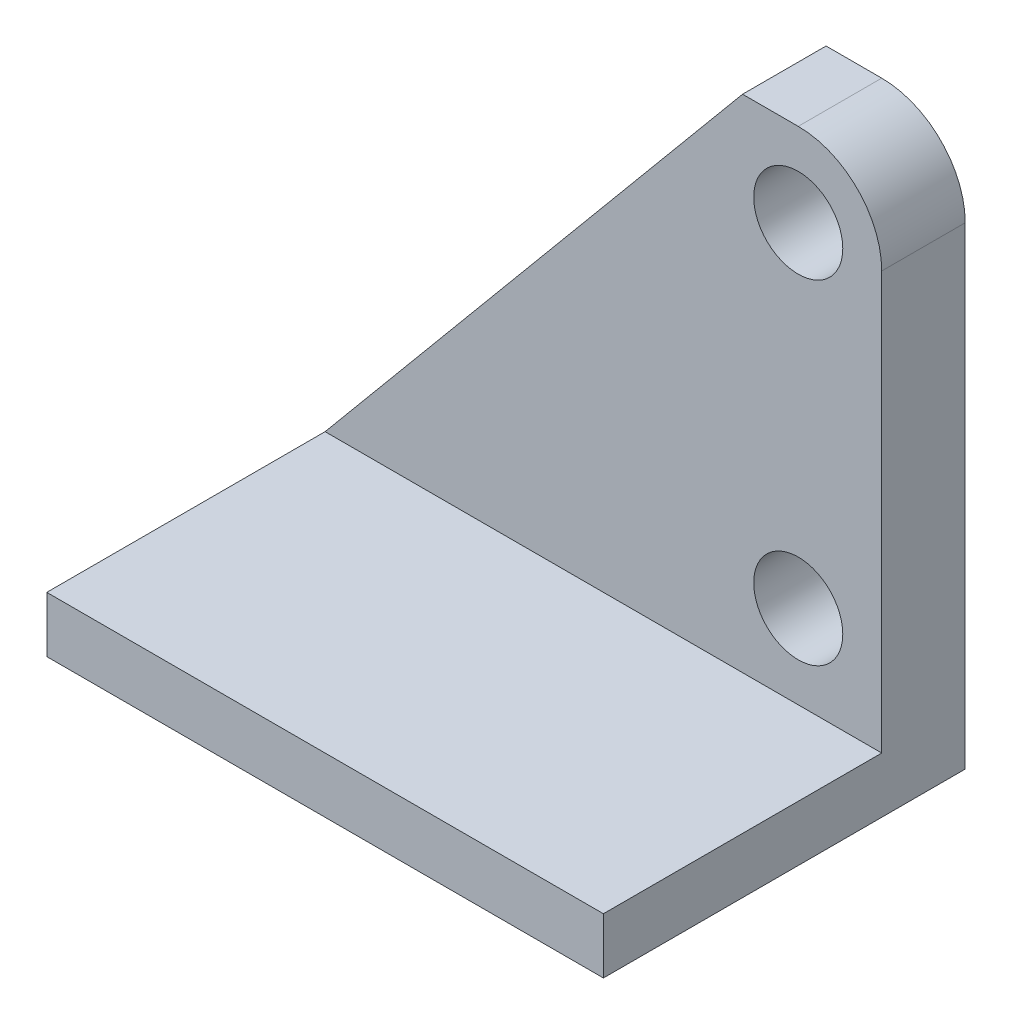
ISO-10303-21;
HEADER;
FILE_DESCRIPTION(('STEP AP214'),'2;1');
FILE_NAME('part.step','',(''),(''),'','','');
FILE_SCHEMA(('AUTOMOTIVE_DESIGN { 1 0 10303 214 1 1 1 1 }'));
ENDSEC;
DATA;
#1=APPLICATION_CONTEXT('core data for automotive mechanical design processes');
#2=APPLICATION_PROTOCOL_DEFINITION('international standard','automotive_design',2000,#1);
#3=PRODUCT_CONTEXT('',#1,'mechanical');
#4=PRODUCT('Part','Part','',(#3));
#5=PRODUCT_RELATED_PRODUCT_CATEGORY('part','',(#4));
#6=PRODUCT_DEFINITION_FORMATION('','',#4);
#7=PRODUCT_DEFINITION_CONTEXT('part definition',#1,'design');
#8=PRODUCT_DEFINITION('design','',#6,#7);
#9=PRODUCT_DEFINITION_SHAPE('','',#8);
#10=(LENGTH_UNIT() NAMED_UNIT(*) SI_UNIT(.MILLI.,.METRE.));
#11=(NAMED_UNIT(*) PLANE_ANGLE_UNIT() SI_UNIT($,.RADIAN.));
#12=(NAMED_UNIT(*) SI_UNIT($,.STERADIAN.) SOLID_ANGLE_UNIT());
#13=UNCERTAINTY_MEASURE_WITH_UNIT(LENGTH_MEASURE(1.E-05),#10,'distance_accuracy_value','');
#14=(GEOMETRIC_REPRESENTATION_CONTEXT(3) GLOBAL_UNCERTAINTY_ASSIGNED_CONTEXT((#13)) GLOBAL_UNIT_ASSIGNED_CONTEXT((#10,
#11,#12)) REPRESENTATION_CONTEXT('',''));
#15=CARTESIAN_POINT('',(0.,0.,0.));
#16=DIRECTION('',(0.,0.,1.));
#17=DIRECTION('',(1.,0.,0.));
#18=AXIS2_PLACEMENT_3D('',#15,#16,#17);
#19=CARTESIAN_POINT('',(17.,17.,3.));
#20=DIRECTION('',(0.,0.,1.));
#21=DIRECTION('',(1.,0.,0.));
#22=AXIS2_PLACEMENT_3D('',#19,#20,#21);
#23=PLANE('',#22);
#24=DIRECTION('',(0.64018439966448,0.768221279597376,0.));
#25=VECTOR('',#24,1.);
#26=CARTESIAN_POINT('',(0.,1.99999999999999,3.));
#27=LINE('',#26,#25);
#28=CARTESIAN_POINT('',(0.,1.99999999999999,3.));
#29=VERTEX_POINT('',#28);
#30=CARTESIAN_POINT('',(15.,20.,3.));
#31=VERTEX_POINT('',#30);
#32=EDGE_CURVE('E48',#29,#31,#27,.T.);
#33=ORIENTED_EDGE('',*,*,#32,.F.);
#34=DIRECTION('',(-1.,0.,0.));
#35=VECTOR('',#34,1.);
#36=CARTESIAN_POINT('',(20.,2.,3.));
#37=LINE('',#36,#35);
#38=CARTESIAN_POINT('',(20.,2.,3.));
#39=VERTEX_POINT('',#38);
#40=EDGE_CURVE('E54',#39,#29,#37,.T.);
#41=ORIENTED_EDGE('',*,*,#40,.F.);
#42=DIRECTION('',(0.,1.,0.));
#43=VECTOR('',#42,1.);
#44=CARTESIAN_POINT('',(20.,0.,3.));
#45=LINE('',#44,#43);
#46=CARTESIAN_POINT('',(20.,17.,3.));
#47=VERTEX_POINT('',#46);
#48=EDGE_CURVE('E136',#39,#47,#45,.T.);
#49=ORIENTED_EDGE('',*,*,#48,.T.);
#50=CARTESIAN_POINT('',(17.,17.,3.));
#51=DIRECTION('',(0.,0.,1.));
#52=DIRECTION('',(1.,0.,0.));
#53=AXIS2_PLACEMENT_3D('',#50,#51,#52);
#54=CIRCLE('',#53,3.);
#55=CARTESIAN_POINT('',(17.,20.,3.));
#56=VERTEX_POINT('',#55);
#57=EDGE_CURVE('E138',#47,#56,#54,.T.);
#58=ORIENTED_EDGE('',*,*,#57,.T.);
#59=DIRECTION('',(-1.,0.,0.));
#60=VECTOR('',#59,1.);
#61=CARTESIAN_POINT('',(0.,20.,3.));
#62=LINE('',#61,#60);
#63=EDGE_CURVE('E103',#56,#31,#62,.T.);
#64=ORIENTED_EDGE('',*,*,#63,.T.);
#65=EDGE_LOOP('',(#33,#41,#49,#58,#64));
#66=FACE_BOUND('',#65,.T.);
#67=CARTESIAN_POINT('',(17.,17.,3.));
#68=DIRECTION('',(0.,0.,1.));
#69=DIRECTION('',(1.,0.,0.));
#70=AXIS2_PLACEMENT_3D('',#67,#68,#69);
#71=CIRCLE('',#70,1.6);
#72=CARTESIAN_POINT('',(18.6,17.,3.));
#73=VERTEX_POINT('',#72);
#74=EDGE_CURVE('E130',#73,#73,#71,.T.);
#75=ORIENTED_EDGE('',*,*,#74,.F.);
#76=EDGE_LOOP('',(#75));
#77=FACE_BOUND('',#76,.T.);
#78=CARTESIAN_POINT('',(17.0000000000002,5.,3.));
#79=DIRECTION('',(0.,0.,1.));
#80=DIRECTION('',(1.,0.,0.));
#81=AXIS2_PLACEMENT_3D('',#78,#79,#80);
#82=CIRCLE('',#81,1.6);
#83=CARTESIAN_POINT('',(18.6000000000002,5.,3.));
#84=VERTEX_POINT('',#83);
#85=EDGE_CURVE('E124',#84,#84,#82,.T.);
#86=ORIENTED_EDGE('',*,*,#85,.F.);
#87=EDGE_LOOP('',(#86));
#88=FACE_BOUND('',#87,.T.);
#89=ADVANCED_FACE('F33',(#66,#77,#88),#23,.T.);
#90=CARTESIAN_POINT('',(17.,17.,0.));
#91=DIRECTION('',(0.,0.,1.));
#92=DIRECTION('',(1.,0.,0.));
#93=AXIS2_PLACEMENT_3D('',#90,#91,#92);
#94=PLANE('',#93);
#95=DIRECTION('',(0.,-1.,0.));
#96=VECTOR('',#95,1.);
#97=CARTESIAN_POINT('',(0.,0.,0.));
#98=LINE('',#97,#96);
#99=CARTESIAN_POINT('',(0.,1.99999999999999,0.));
#100=VERTEX_POINT('',#99);
#101=CARTESIAN_POINT('',(0.,0.,0.));
#102=VERTEX_POINT('',#101);
#103=EDGE_CURVE('E133',#100,#102,#98,.T.);
#104=ORIENTED_EDGE('',*,*,#103,.F.);
#105=DIRECTION('',(0.64018439966448,0.768221279597376,0.));
#106=VECTOR('',#105,1.);
#107=CARTESIAN_POINT('',(14.344262295082,19.2131147540984,0.));
#108=LINE('',#107,#106);
#109=CARTESIAN_POINT('',(15.,20.,0.));
#110=VERTEX_POINT('',#109);
#111=EDGE_CURVE('E95',#100,#110,#108,.T.);
#112=ORIENTED_EDGE('',*,*,#111,.T.);
#113=DIRECTION('',(-1.,0.,0.));
#114=VECTOR('',#113,1.);
#115=CARTESIAN_POINT('',(0.,20.,0.));
#116=LINE('',#115,#114);
#117=CARTESIAN_POINT('',(17.,20.,0.));
#118=VERTEX_POINT('',#117);
#119=EDGE_CURVE('E139',#118,#110,#116,.T.);
#120=ORIENTED_EDGE('',*,*,#119,.F.);
#121=CARTESIAN_POINT('',(17.,17.,0.));
#122=DIRECTION('',(0.,0.,1.));
#123=DIRECTION('',(1.,0.,0.));
#124=AXIS2_PLACEMENT_3D('',#121,#122,#123);
#125=CIRCLE('',#124,3.);
#126=CARTESIAN_POINT('',(20.,17.,0.));
#127=VERTEX_POINT('',#126);
#128=EDGE_CURVE('E148',#127,#118,#125,.T.);
#129=ORIENTED_EDGE('',*,*,#128,.F.);
#130=DIRECTION('',(0.,1.,0.));
#131=VECTOR('',#130,1.);
#132=CARTESIAN_POINT('',(20.,0.,0.));
#133=LINE('',#132,#131);
#134=CARTESIAN_POINT('',(20.,0.,0.));
#135=VERTEX_POINT('',#134);
#136=EDGE_CURVE('E146',#135,#127,#133,.T.);
#137=ORIENTED_EDGE('',*,*,#136,.F.);
#138=DIRECTION('',(1.,0.,0.));
#139=VECTOR('',#138,1.);
#140=CARTESIAN_POINT('',(0.,0.,0.));
#141=LINE('',#140,#139);
#142=EDGE_CURVE('E144',#102,#135,#141,.T.);
#143=ORIENTED_EDGE('',*,*,#142,.F.);
#144=EDGE_LOOP('',(#104,#112,#120,#129,#137,#143));
#145=FACE_BOUND('',#144,.T.);
#146=CARTESIAN_POINT('',(17.,17.,0.));
#147=DIRECTION('',(0.,0.,1.));
#148=DIRECTION('',(1.,0.,0.));
#149=AXIS2_PLACEMENT_3D('',#146,#147,#148);
#150=CIRCLE('',#149,1.6);
#151=CARTESIAN_POINT('',(18.6,17.,0.));
#152=VERTEX_POINT('',#151);
#153=EDGE_CURVE('E127',#152,#152,#150,.T.);
#154=ORIENTED_EDGE('',*,*,#153,.T.);
#155=EDGE_LOOP('',(#154));
#156=FACE_BOUND('',#155,.T.);
#157=CARTESIAN_POINT('',(17.0000000000002,5.,0.));
#158=DIRECTION('',(0.,0.,1.));
#159=DIRECTION('',(1.,0.,0.));
#160=AXIS2_PLACEMENT_3D('',#157,#158,#159);
#161=CIRCLE('',#160,1.6);
#162=CARTESIAN_POINT('',(18.6000000000002,5.,0.));
#163=VERTEX_POINT('',#162);
#164=EDGE_CURVE('E119',#163,#163,#161,.T.);
#165=ORIENTED_EDGE('',*,*,#164,.T.);
#166=EDGE_LOOP('',(#165));
#167=FACE_BOUND('',#166,.T.);
#168=ADVANCED_FACE('F175',(#145,#156,#167),#94,.F.);
#169=CARTESIAN_POINT('',(0.,0.,3.));
#170=DIRECTION('',(1.,0.,0.));
#171=DIRECTION('',(0.,0.,-1.));
#172=AXIS2_PLACEMENT_3D('',#169,#170,#171);
#173=PLANE('',#172);
#174=DIRECTION('',(0.,0.,-1.));
#175=VECTOR('',#174,1.);
#176=CARTESIAN_POINT('',(0.,1.99999999999999,13.));
#177=LINE('',#176,#175);
#178=CARTESIAN_POINT('',(0.,1.99999999999999,13.));
#179=VERTEX_POINT('',#178);
#180=EDGE_CURVE('E109',#179,#29,#177,.T.);
#181=ORIENTED_EDGE('',*,*,#180,.T.);
#182=DIRECTION('',(0.,0.,1.));
#183=VECTOR('',#182,1.);
#184=CARTESIAN_POINT('',(0.,1.99999999999999,-17.));
#185=LINE('',#184,#183);
#186=EDGE_CURVE('E92',#100,#29,#185,.T.);
#187=ORIENTED_EDGE('',*,*,#186,.F.);
#188=ORIENTED_EDGE('',*,*,#103,.T.);
#189=DIRECTION('',(0.,0.,-1.));
#190=VECTOR('',#189,1.);
#191=CARTESIAN_POINT('',(0.,0.,3.));
#192=LINE('',#191,#190);
#193=CARTESIAN_POINT('',(0.,0.,13.));
#194=VERTEX_POINT('',#193);
#195=EDGE_CURVE('E41',#194,#102,#192,.T.);
#196=ORIENTED_EDGE('',*,*,#195,.F.);
#197=DIRECTION('',(0.,-1.,0.));
#198=VECTOR('',#197,1.);
#199=CARTESIAN_POINT('',(0.,0.,13.));
#200=LINE('',#199,#198);
#201=EDGE_CURVE('E116',#179,#194,#200,.T.);
#202=ORIENTED_EDGE('',*,*,#201,.F.);
#203=EDGE_LOOP('',(#181,#187,#188,#196,#202));
#204=FACE_BOUND('',#203,.T.);
#205=ADVANCED_FACE('F35',(#204),#173,.F.);
#206=CARTESIAN_POINT('',(0.,0.,3.));
#207=DIRECTION('',(0.,1.,0.));
#208=DIRECTION('',(0.,0.,1.));
#209=AXIS2_PLACEMENT_3D('',#206,#207,#208);
#210=PLANE('',#209);
#211=ORIENTED_EDGE('',*,*,#142,.T.);
#212=DIRECTION('',(0.,0.,-1.));
#213=VECTOR('',#212,1.);
#214=CARTESIAN_POINT('',(20.,0.,3.));
#215=LINE('',#214,#213);
#216=CARTESIAN_POINT('',(20.,0.,13.));
#217=VERTEX_POINT('',#216);
#218=EDGE_CURVE('E157',#217,#135,#215,.T.);
#219=ORIENTED_EDGE('',*,*,#218,.F.);
#220=DIRECTION('',(1.,0.,0.));
#221=VECTOR('',#220,1.);
#222=CARTESIAN_POINT('',(20.,0.,13.));
#223=LINE('',#222,#221);
#224=EDGE_CURVE('E117',#194,#217,#223,.T.);
#225=ORIENTED_EDGE('',*,*,#224,.F.);
#226=ORIENTED_EDGE('',*,*,#195,.T.);
#227=EDGE_LOOP('',(#211,#219,#225,#226));
#228=FACE_BOUND('',#227,.T.);
#229=ADVANCED_FACE('F162',(#228),#210,.F.);
#230=CARTESIAN_POINT('',(20.,0.,3.));
#231=DIRECTION('',(-1.,0.,0.));
#232=DIRECTION('',(0.,0.,1.));
#233=AXIS2_PLACEMENT_3D('',#230,#231,#232);
#234=PLANE('',#233);
#235=ORIENTED_EDGE('',*,*,#136,.T.);
#236=DIRECTION('',(0.,0.,-1.));
#237=VECTOR('',#236,1.);
#238=CARTESIAN_POINT('',(20.,17.,3.));
#239=LINE('',#238,#237);
#240=EDGE_CURVE('E154',#47,#127,#239,.T.);
#241=ORIENTED_EDGE('',*,*,#240,.F.);
#242=ORIENTED_EDGE('',*,*,#48,.F.);
#243=DIRECTION('',(0.,0.,-1.));
#244=VECTOR('',#243,1.);
#245=CARTESIAN_POINT('',(20.,2.,13.));
#246=LINE('',#245,#244);
#247=CARTESIAN_POINT('',(20.,2.,13.));
#248=VERTEX_POINT('',#247);
#249=EDGE_CURVE('E112',#248,#39,#246,.T.);
#250=ORIENTED_EDGE('',*,*,#249,.F.);
#251=DIRECTION('',(0.,1.,0.));
#252=VECTOR('',#251,1.);
#253=CARTESIAN_POINT('',(20.,0.,13.));
#254=LINE('',#253,#252);
#255=EDGE_CURVE('E113',#217,#248,#254,.T.);
#256=ORIENTED_EDGE('',*,*,#255,.F.);
#257=ORIENTED_EDGE('',*,*,#218,.T.);
#258=EDGE_LOOP('',(#235,#241,#242,#250,#256,#257));
#259=FACE_BOUND('',#258,.T.);
#260=ADVANCED_FACE('F187',(#259),#234,.F.);
#261=CARTESIAN_POINT('',(17.,17.,3.));
#262=DIRECTION('',(0.,0.,-1.));
#263=DIRECTION('',(-1.,0.,0.));
#264=AXIS2_PLACEMENT_3D('',#261,#262,#263);
#265=CYLINDRICAL_SURFACE('',#264,3.);
#266=ORIENTED_EDGE('',*,*,#128,.T.);
#267=DIRECTION('',(0.,0.,-1.));
#268=VECTOR('',#267,1.);
#269=CARTESIAN_POINT('',(17.,20.,3.));
#270=LINE('',#269,#268);
#271=EDGE_CURVE('E142',#56,#118,#270,.T.);
#272=ORIENTED_EDGE('',*,*,#271,.F.);
#273=ORIENTED_EDGE('',*,*,#57,.F.);
#274=ORIENTED_EDGE('',*,*,#240,.T.);
#275=EDGE_LOOP('',(#266,#272,#273,#274));
#276=FACE_BOUND('',#275,.T.);
#277=ADVANCED_FACE('F183',(#276),#265,.T.);
#278=CARTESIAN_POINT('',(0.,20.,3.));
#279=DIRECTION('',(0.,-1.,0.));
#280=DIRECTION('',(0.,0.,-1.));
#281=AXIS2_PLACEMENT_3D('',#278,#279,#280);
#282=PLANE('',#281);
#283=ORIENTED_EDGE('',*,*,#119,.T.);
#284=DIRECTION('',(0.,0.,1.));
#285=VECTOR('',#284,1.);
#286=CARTESIAN_POINT('',(15.,20.,3.));
#287=LINE('',#286,#285);
#288=EDGE_CURVE('E11',#110,#31,#287,.T.);
#289=ORIENTED_EDGE('',*,*,#288,.T.);
#290=ORIENTED_EDGE('',*,*,#63,.F.);
#291=ORIENTED_EDGE('',*,*,#271,.T.);
#292=EDGE_LOOP('',(#283,#289,#290,#291));
#293=FACE_BOUND('',#292,.T.);
#294=ADVANCED_FACE('F179',(#293),#282,.F.);
#295=CARTESIAN_POINT('',(17.,17.,3.));
#296=DIRECTION('',(0.,0.,-1.));
#297=DIRECTION('',(-1.,0.,0.));
#298=AXIS2_PLACEMENT_3D('',#295,#296,#297);
#299=CYLINDRICAL_SURFACE('',#298,1.6);
#300=ORIENTED_EDGE('',*,*,#74,.T.);
#301=EDGE_LOOP('',(#300));
#302=FACE_BOUND('',#301,.T.);
#303=ORIENTED_EDGE('',*,*,#153,.F.);
#304=EDGE_LOOP('',(#303));
#305=FACE_BOUND('',#304,.T.);
#306=ADVANCED_FACE('F202',(#302,#305),#299,.F.);
#307=CARTESIAN_POINT('',(17.0000000000002,5.,3.));
#308=DIRECTION('',(0.,0.,-1.));
#309=DIRECTION('',(-1.,0.,0.));
#310=AXIS2_PLACEMENT_3D('',#307,#308,#309);
#311=CYLINDRICAL_SURFACE('',#310,1.6);
#312=ORIENTED_EDGE('',*,*,#85,.T.);
#313=EDGE_LOOP('',(#312));
#314=FACE_BOUND('',#313,.T.);
#315=ORIENTED_EDGE('',*,*,#164,.F.);
#316=EDGE_LOOP('',(#315));
#317=FACE_BOUND('',#316,.T.);
#318=ADVANCED_FACE('F209',(#314,#317),#311,.F.);
#319=CARTESIAN_POINT('',(20.,2.,13.));
#320=DIRECTION('',(0.,-1.,0.));
#321=DIRECTION('',(1.,0.,0.));
#322=AXIS2_PLACEMENT_3D('',#319,#320,#321);
#323=PLANE('',#322);
#324=ORIENTED_EDGE('',*,*,#40,.T.);
#325=ORIENTED_EDGE('',*,*,#180,.F.);
#326=DIRECTION('',(-1.,0.,0.));
#327=VECTOR('',#326,1.);
#328=CARTESIAN_POINT('',(20.,2.,13.));
#329=LINE('',#328,#327);
#330=EDGE_CURVE('E168',#248,#179,#329,.T.);
#331=ORIENTED_EDGE('',*,*,#330,.F.);
#332=ORIENTED_EDGE('',*,*,#249,.T.);
#333=EDGE_LOOP('',(#324,#325,#331,#332));
#334=FACE_BOUND('',#333,.T.);
#335=ADVANCED_FACE('F108',(#334),#323,.F.);
#336=CARTESIAN_POINT('',(0.,0.,13.));
#337=DIRECTION('',(0.,0.,1.));
#338=DIRECTION('',(1.,0.,0.));
#339=AXIS2_PLACEMENT_3D('',#336,#337,#338);
#340=PLANE('',#339);
#341=ORIENTED_EDGE('',*,*,#255,.T.);
#342=ORIENTED_EDGE('',*,*,#330,.T.);
#343=ORIENTED_EDGE('',*,*,#201,.T.);
#344=ORIENTED_EDGE('',*,*,#224,.T.);
#345=EDGE_LOOP('',(#341,#342,#343,#344));
#346=FACE_BOUND('',#345,.T.);
#347=ADVANCED_FACE('F166',(#346),#340,.T.);
#348=CARTESIAN_POINT('',(0.,1.99999999999999,-17.));
#349=DIRECTION('',(0.768221279597376,-0.64018439966448,0.));
#350=DIRECTION('',(0.64018439966448,0.768221279597376,0.));
#351=AXIS2_PLACEMENT_3D('',#348,#349,#350);
#352=PLANE('',#351);
#353=ORIENTED_EDGE('',*,*,#186,.T.);
#354=ORIENTED_EDGE('',*,*,#32,.T.);
#355=ORIENTED_EDGE('',*,*,#288,.F.);
#356=ORIENTED_EDGE('',*,*,#111,.F.);
#357=EDGE_LOOP('',(#353,#354,#355,#356));
#358=FACE_BOUND('',#357,.T.);
#359=ADVANCED_FACE('F93',(#358),#352,.F.);
#360=CLOSED_SHELL('',(#89,#168,#205,#229,#260,#277,#294,#306,#318,#335,#347,#359));
#361=MANIFOLD_SOLID_BREP('B2',#360);
#362=ADVANCED_BREP_SHAPE_REPRESENTATION('',(#18,#361),#14);
#363=SHAPE_DEFINITION_REPRESENTATION(#9,#362);
ENDSEC;
END-ISO-10303-21;
